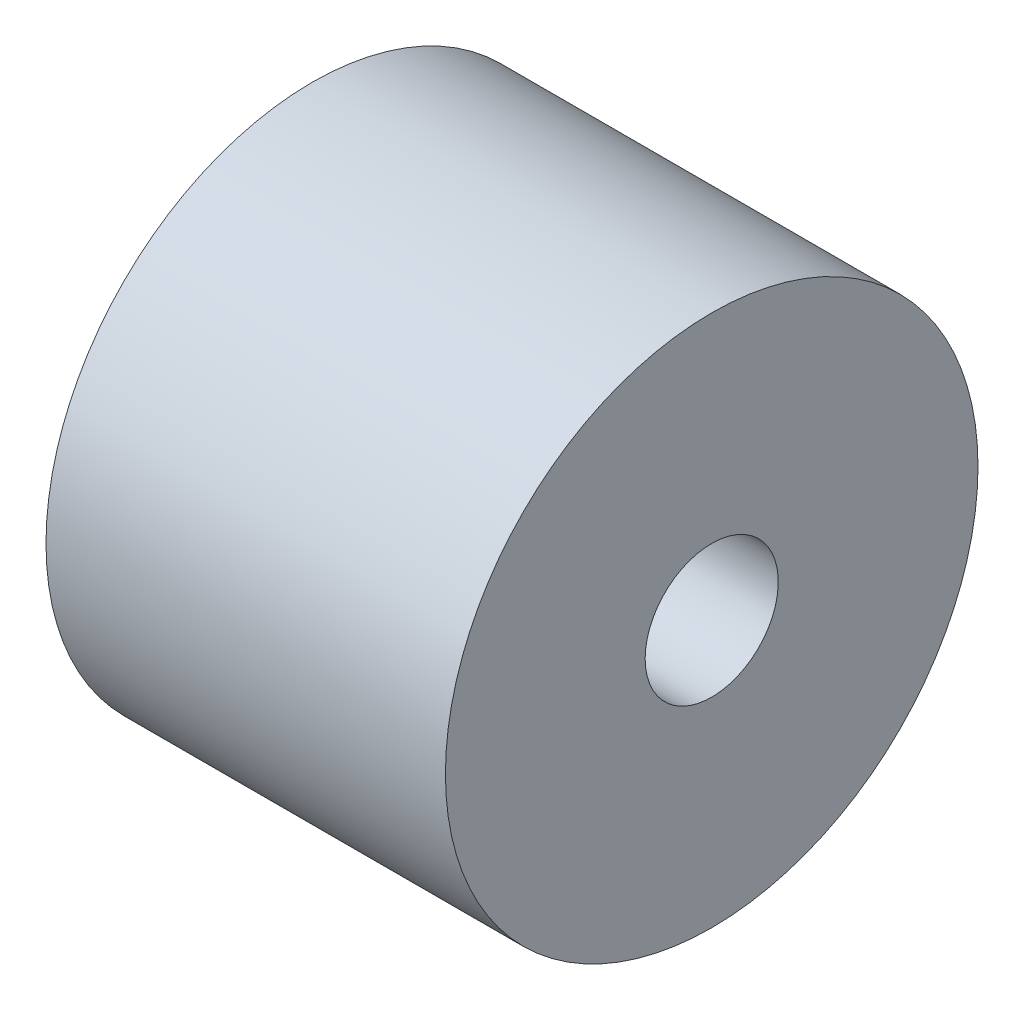
ISO-10303-21;
HEADER;
FILE_DESCRIPTION(('STEP AP214'),'2;1');
FILE_NAME('part.step','',(''),(''),'','','');
FILE_SCHEMA(('AUTOMOTIVE_DESIGN { 1 0 10303 214 1 1 1 1 }'));
ENDSEC;
DATA;
#1=APPLICATION_CONTEXT('core data for automotive mechanical design processes');
#2=APPLICATION_PROTOCOL_DEFINITION('international standard','automotive_design',2000,#1);
#3=PRODUCT_CONTEXT('',#1,'mechanical');
#4=PRODUCT('Part','Part','',(#3));
#5=PRODUCT_RELATED_PRODUCT_CATEGORY('part','',(#4));
#6=PRODUCT_DEFINITION_FORMATION('','',#4);
#7=PRODUCT_DEFINITION_CONTEXT('part definition',#1,'design');
#8=PRODUCT_DEFINITION('design','',#6,#7);
#9=PRODUCT_DEFINITION_SHAPE('','',#8);
#10=(LENGTH_UNIT() NAMED_UNIT(*) SI_UNIT(.MILLI.,.METRE.));
#11=(NAMED_UNIT(*) PLANE_ANGLE_UNIT() SI_UNIT($,.RADIAN.));
#12=(NAMED_UNIT(*) SI_UNIT($,.STERADIAN.) SOLID_ANGLE_UNIT());
#13=UNCERTAINTY_MEASURE_WITH_UNIT(LENGTH_MEASURE(1.E-05),#10,'distance_accuracy_value','');
#14=(GEOMETRIC_REPRESENTATION_CONTEXT(3) GLOBAL_UNCERTAINTY_ASSIGNED_CONTEXT((#13)) GLOBAL_UNIT_ASSIGNED_CONTEXT((#10,
#11,#12)) REPRESENTATION_CONTEXT('',''));
#15=CARTESIAN_POINT('',(0.,0.,0.));
#16=DIRECTION('',(0.,0.,1.));
#17=DIRECTION('',(1.,0.,0.));
#18=AXIS2_PLACEMENT_3D('',#15,#16,#17);
#19=CARTESIAN_POINT('',(0.,4.,0.));
#20=DIRECTION('',(1.,0.,0.));
#21=DIRECTION('',(0.,0.,-1.));
#22=AXIS2_PLACEMENT_3D('',#19,#20,#21);
#23=PLANE('',#22);
#24=CARTESIAN_POINT('',(0.,0.,0.));
#25=DIRECTION('',(-1.,0.,0.));
#26=DIRECTION('',(0.,0.,1.));
#27=AXIS2_PLACEMENT_3D('',#24,#25,#26);
#28=CIRCLE('',#27,1.);
#29=CARTESIAN_POINT('',(0.,0.,1.));
#30=VERTEX_POINT('',#29);
#31=EDGE_CURVE('E10',#30,#30,#28,.T.);
#32=ORIENTED_EDGE('',*,*,#31,.F.);
#33=EDGE_LOOP('',(#32));
#34=FACE_BOUND('',#33,.T.);
#35=CARTESIAN_POINT('',(0.,0.,0.));
#36=DIRECTION('',(-1.,0.,0.));
#37=DIRECTION('',(0.,0.,1.));
#38=AXIS2_PLACEMENT_3D('',#35,#36,#37);
#39=CIRCLE('',#38,4.);
#40=CARTESIAN_POINT('',(0.,0.,4.));
#41=VERTEX_POINT('',#40);
#42=EDGE_CURVE('E52',#41,#41,#39,.T.);
#43=ORIENTED_EDGE('',*,*,#42,.T.);
#44=EDGE_LOOP('',(#43));
#45=FACE_BOUND('',#44,.T.);
#46=ADVANCED_FACE('F39',(#34,#45),#23,.F.);
#47=CARTESIAN_POINT('',(-400.,0.,0.));
#48=DIRECTION('',(-1.,0.,0.));
#49=DIRECTION('',(0.,0.,1.));
#50=AXIS2_PLACEMENT_3D('',#47,#48,#49);
#51=CYLINDRICAL_SURFACE('',#50,1.);
#52=CARTESIAN_POINT('',(6.00000000000001,0.,0.));
#53=DIRECTION('',(-1.,0.,0.));
#54=DIRECTION('',(0.,0.,1.));
#55=AXIS2_PLACEMENT_3D('',#52,#53,#54);
#56=CIRCLE('',#55,1.);
#57=CARTESIAN_POINT('',(6.00000000000001,0.,1.));
#58=VERTEX_POINT('',#57);
#59=EDGE_CURVE('E44',#58,#58,#56,.T.);
#60=ORIENTED_EDGE('',*,*,#59,.F.);
#61=EDGE_LOOP('',(#60));
#62=FACE_BOUND('',#61,.T.);
#63=ORIENTED_EDGE('',*,*,#31,.T.);
#64=EDGE_LOOP('',(#63));
#65=FACE_BOUND('',#64,.T.);
#66=ADVANCED_FACE('F66',(#62,#65),#51,.F.);
#67=CARTESIAN_POINT('',(6.,1.,0.));
#68=DIRECTION('',(-1.,0.,0.));
#69=DIRECTION('',(0.,0.,1.));
#70=AXIS2_PLACEMENT_3D('',#67,#68,#69);
#71=PLANE('',#70);
#72=CARTESIAN_POINT('',(6.00000000000001,0.,0.));
#73=DIRECTION('',(-1.,0.,0.));
#74=DIRECTION('',(0.,0.,1.));
#75=AXIS2_PLACEMENT_3D('',#72,#73,#74);
#76=CIRCLE('',#75,4.);
#77=CARTESIAN_POINT('',(6.00000000000001,0.,4.));
#78=VERTEX_POINT('',#77);
#79=EDGE_CURVE('E47',#78,#78,#76,.T.);
#80=ORIENTED_EDGE('',*,*,#79,.F.);
#81=EDGE_LOOP('',(#80));
#82=FACE_BOUND('',#81,.T.);
#83=ORIENTED_EDGE('',*,*,#59,.T.);
#84=EDGE_LOOP('',(#83));
#85=FACE_BOUND('',#84,.T.);
#86=ADVANCED_FACE('F63',(#82,#85),#71,.F.);
#87=CARTESIAN_POINT('',(-400.,0.,0.));
#88=DIRECTION('',(-1.,0.,0.));
#89=DIRECTION('',(0.,0.,1.));
#90=AXIS2_PLACEMENT_3D('',#87,#88,#89);
#91=CYLINDRICAL_SURFACE('',#90,4.);
#92=ORIENTED_EDGE('',*,*,#42,.F.);
#93=EDGE_LOOP('',(#92));
#94=FACE_BOUND('',#93,.T.);
#95=ORIENTED_EDGE('',*,*,#79,.T.);
#96=EDGE_LOOP('',(#95));
#97=FACE_BOUND('',#96,.T.);
#98=ADVANCED_FACE('F58',(#94,#97),#91,.T.);
#99=CLOSED_SHELL('',(#46,#66,#86,#98));
#100=MANIFOLD_SOLID_BREP('B2',#99);
#101=ADVANCED_BREP_SHAPE_REPRESENTATION('',(#18,#100),#14);
#102=SHAPE_DEFINITION_REPRESENTATION(#9,#101);
ENDSEC;
END-ISO-10303-21;
